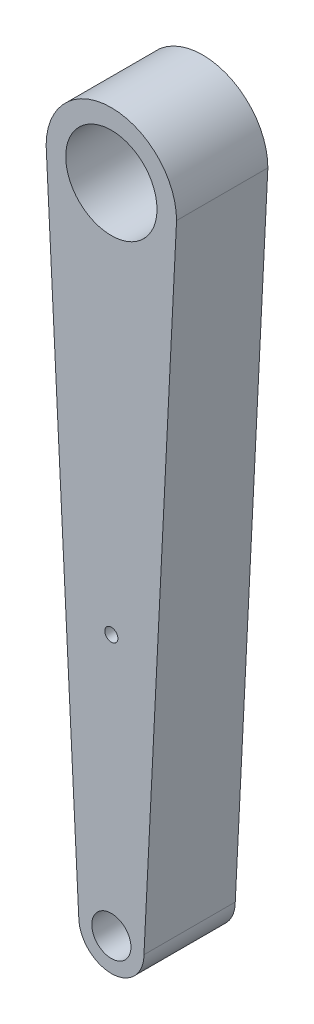
ISO-10303-21;
HEADER;
FILE_DESCRIPTION(('STEP AP214'),'2;1');
FILE_NAME('part.step','',(''),(''),'','','');
FILE_SCHEMA(('AUTOMOTIVE_DESIGN { 1 0 10303 214 1 1 1 1 }'));
ENDSEC;
DATA;
#1=APPLICATION_CONTEXT('core data for automotive mechanical design processes');
#2=APPLICATION_PROTOCOL_DEFINITION('international standard','automotive_design',2000,#1);
#3=PRODUCT_CONTEXT('',#1,'mechanical');
#4=PRODUCT('Part','Part','',(#3));
#5=PRODUCT_RELATED_PRODUCT_CATEGORY('part','',(#4));
#6=PRODUCT_DEFINITION_FORMATION('','',#4);
#7=PRODUCT_DEFINITION_CONTEXT('part definition',#1,'design');
#8=PRODUCT_DEFINITION('design','',#6,#7);
#9=PRODUCT_DEFINITION_SHAPE('','',#8);
#10=(LENGTH_UNIT() NAMED_UNIT(*) SI_UNIT(.MILLI.,.METRE.));
#11=(NAMED_UNIT(*) PLANE_ANGLE_UNIT() SI_UNIT($,.RADIAN.));
#12=(NAMED_UNIT(*) SI_UNIT($,.STERADIAN.) SOLID_ANGLE_UNIT());
#13=UNCERTAINTY_MEASURE_WITH_UNIT(LENGTH_MEASURE(1.E-05),#10,'distance_accuracy_value','');
#14=(GEOMETRIC_REPRESENTATION_CONTEXT(3) GLOBAL_UNCERTAINTY_ASSIGNED_CONTEXT((#13)) GLOBAL_UNIT_ASSIGNED_CONTEXT((#10,
#11,#12)) REPRESENTATION_CONTEXT('',''));
#15=CARTESIAN_POINT('',(0.,0.,0.));
#16=DIRECTION('',(0.,0.,1.));
#17=DIRECTION('',(1.,0.,0.));
#18=AXIS2_PLACEMENT_3D('',#15,#16,#17);
#19=CARTESIAN_POINT('',(-3.49127182044888,-0.174563591022444,7.));
#20=DIRECTION('',(-0.998752338877845,-0.0499376169438922,0.));
#21=DIRECTION('',(0.0499376169438922,-0.998752338877845,0.));
#22=AXIS2_PLACEMENT_3D('',#19,#20,#21);
#23=PLANE('',#22);
#24=DIRECTION('',(-0.0499376169438922,0.998752338877845,0.));
#25=VECTOR('',#24,1.);
#26=CARTESIAN_POINT('',(-3.49127182044888,-0.174563591022444,0.));
#27=LINE('',#26,#25);
#28=CARTESIAN_POINT('',(-2.5,-20.,0.));
#29=VERTEX_POINT('',#28);
#30=CARTESIAN_POINT('',(-5.,30.,0.));
#31=VERTEX_POINT('',#30);
#32=EDGE_CURVE('E110',#29,#31,#27,.T.);
#33=ORIENTED_EDGE('',*,*,#32,.F.);
#34=DIRECTION('',(0.,0.,-1.));
#35=VECTOR('',#34,1.);
#36=CARTESIAN_POINT('',(-2.5,-20.,7.));
#37=LINE('',#36,#35);
#38=CARTESIAN_POINT('',(-2.5,-20.,7.));
#39=VERTEX_POINT('',#38);
#40=EDGE_CURVE('E11',#39,#29,#37,.T.);
#41=ORIENTED_EDGE('',*,*,#40,.F.);
#42=DIRECTION('',(-0.0499376169438922,0.998752338877845,0.));
#43=VECTOR('',#42,1.);
#44=CARTESIAN_POINT('',(-3.49127182044888,-0.174563591022444,7.));
#45=LINE('',#44,#43);
#46=CARTESIAN_POINT('',(-5.,30.,7.));
#47=VERTEX_POINT('',#46);
#48=EDGE_CURVE('E88',#39,#47,#45,.T.);
#49=ORIENTED_EDGE('',*,*,#48,.T.);
#50=DIRECTION('',(0.,0.,-1.));
#51=VECTOR('',#50,1.);
#52=CARTESIAN_POINT('',(-5.,30.,7.));
#53=LINE('',#52,#51);
#54=EDGE_CURVE('E78',#47,#31,#53,.T.);
#55=ORIENTED_EDGE('',*,*,#54,.T.);
#56=EDGE_LOOP('',(#33,#41,#49,#55));
#57=FACE_BOUND('',#56,.T.);
#58=ADVANCED_FACE('F39',(#57),#23,.T.);
#59=CARTESIAN_POINT('',(0.,-20.,7.));
#60=DIRECTION('',(0.,0.,-1.));
#61=DIRECTION('',(-1.,0.,0.));
#62=AXIS2_PLACEMENT_3D('',#59,#60,#61);
#63=CYLINDRICAL_SURFACE('',#62,2.5);
#64=CARTESIAN_POINT('',(0.,-20.,0.));
#65=DIRECTION('',(0.,0.,1.));
#66=DIRECTION('',(1.,0.,0.));
#67=AXIS2_PLACEMENT_3D('',#64,#65,#66);
#68=CIRCLE('',#67,2.5);
#69=CARTESIAN_POINT('',(2.5,-20.,0.));
#70=VERTEX_POINT('',#69);
#71=EDGE_CURVE('E94',#29,#70,#68,.T.);
#72=ORIENTED_EDGE('',*,*,#71,.T.);
#73=DIRECTION('',(0.,0.,-1.));
#74=VECTOR('',#73,1.);
#75=CARTESIAN_POINT('',(2.5,-20.,7.));
#76=LINE('',#75,#74);
#77=CARTESIAN_POINT('',(2.5,-20.,7.));
#78=VERTEX_POINT('',#77);
#79=EDGE_CURVE('E48',#78,#70,#76,.T.);
#80=ORIENTED_EDGE('',*,*,#79,.F.);
#81=CARTESIAN_POINT('',(0.,-20.,7.));
#82=DIRECTION('',(0.,0.,1.));
#83=DIRECTION('',(1.,0.,0.));
#84=AXIS2_PLACEMENT_3D('',#81,#82,#83);
#85=CIRCLE('',#84,2.5);
#86=EDGE_CURVE('E83',#39,#78,#85,.T.);
#87=ORIENTED_EDGE('',*,*,#86,.F.);
#88=ORIENTED_EDGE('',*,*,#40,.T.);
#89=EDGE_LOOP('',(#72,#80,#87,#88));
#90=FACE_BOUND('',#89,.T.);
#91=ADVANCED_FACE('F92',(#90),#63,.T.);
#92=CARTESIAN_POINT('',(3.49127182044888,-0.174563591022444,7.));
#93=DIRECTION('',(0.998752338877845,-0.0499376169438922,0.));
#94=DIRECTION('',(0.0499376169438922,0.998752338877845,0.));
#95=AXIS2_PLACEMENT_3D('',#92,#93,#94);
#96=PLANE('',#95);
#97=DIRECTION('',(-0.0499376169438922,-0.998752338877845,0.));
#98=VECTOR('',#97,1.);
#99=CARTESIAN_POINT('',(3.49127182044888,-0.174563591022444,0.));
#100=LINE('',#99,#98);
#101=CARTESIAN_POINT('',(5.,30.,0.));
#102=VERTEX_POINT('',#101);
#103=EDGE_CURVE('E114',#102,#70,#100,.T.);
#104=ORIENTED_EDGE('',*,*,#103,.F.);
#105=DIRECTION('',(0.,0.,-1.));
#106=VECTOR('',#105,1.);
#107=CARTESIAN_POINT('',(5.,30.,7.));
#108=LINE('',#107,#106);
#109=CARTESIAN_POINT('',(5.,30.,7.));
#110=VERTEX_POINT('',#109);
#111=EDGE_CURVE('E71',#110,#102,#108,.T.);
#112=ORIENTED_EDGE('',*,*,#111,.F.);
#113=DIRECTION('',(-0.0499376169438922,-0.998752338877845,0.));
#114=VECTOR('',#113,1.);
#115=CARTESIAN_POINT('',(3.49127182044888,-0.174563591022444,7.));
#116=LINE('',#115,#114);
#117=EDGE_CURVE('E87',#110,#78,#116,.T.);
#118=ORIENTED_EDGE('',*,*,#117,.T.);
#119=ORIENTED_EDGE('',*,*,#79,.T.);
#120=EDGE_LOOP('',(#104,#112,#118,#119));
#121=FACE_BOUND('',#120,.T.);
#122=ADVANCED_FACE('F98',(#121),#96,.T.);
#123=CARTESIAN_POINT('',(0.,30.,7.));
#124=DIRECTION('',(0.,0.,-1.));
#125=DIRECTION('',(-1.,0.,0.));
#126=AXIS2_PLACEMENT_3D('',#123,#124,#125);
#127=CYLINDRICAL_SURFACE('',#126,3.5);
#128=CARTESIAN_POINT('',(0.,30.,7.));
#129=DIRECTION('',(0.,0.,1.));
#130=DIRECTION('',(1.,0.,0.));
#131=AXIS2_PLACEMENT_3D('',#128,#129,#130);
#132=CIRCLE('',#131,3.5);
#133=CARTESIAN_POINT('',(3.5,30.,7.));
#134=VERTEX_POINT('',#133);
#135=EDGE_CURVE('E126',#134,#134,#132,.T.);
#136=ORIENTED_EDGE('',*,*,#135,.T.);
#137=EDGE_LOOP('',(#136));
#138=FACE_BOUND('',#137,.T.);
#139=CARTESIAN_POINT('',(0.,30.,0.));
#140=DIRECTION('',(0.,0.,1.));
#141=DIRECTION('',(1.,0.,0.));
#142=AXIS2_PLACEMENT_3D('',#139,#140,#141);
#143=CIRCLE('',#142,3.5);
#144=CARTESIAN_POINT('',(3.5,30.,0.));
#145=VERTEX_POINT('',#144);
#146=EDGE_CURVE('E106',#145,#145,#143,.T.);
#147=ORIENTED_EDGE('',*,*,#146,.F.);
#148=EDGE_LOOP('',(#147));
#149=FACE_BOUND('',#148,.T.);
#150=ADVANCED_FACE('F139',(#138,#149),#127,.F.);
#151=CARTESIAN_POINT('',(0.,-20.,7.));
#152=DIRECTION('',(0.,0.,-1.));
#153=DIRECTION('',(-1.,0.,0.));
#154=AXIS2_PLACEMENT_3D('',#151,#152,#153);
#155=CYLINDRICAL_SURFACE('',#154,1.5);
#156=CARTESIAN_POINT('',(0.,-20.,7.));
#157=DIRECTION('',(0.,0.,1.));
#158=DIRECTION('',(1.,0.,0.));
#159=AXIS2_PLACEMENT_3D('',#156,#157,#158);
#160=CIRCLE('',#159,1.5);
#161=CARTESIAN_POINT('',(1.5,-20.,7.));
#162=VERTEX_POINT('',#161);
#163=EDGE_CURVE('E121',#162,#162,#160,.T.);
#164=ORIENTED_EDGE('',*,*,#163,.T.);
#165=EDGE_LOOP('',(#164));
#166=FACE_BOUND('',#165,.T.);
#167=CARTESIAN_POINT('',(0.,-20.,0.));
#168=DIRECTION('',(0.,0.,1.));
#169=DIRECTION('',(1.,0.,0.));
#170=AXIS2_PLACEMENT_3D('',#167,#168,#169);
#171=CIRCLE('',#170,1.5);
#172=CARTESIAN_POINT('',(1.5,-20.,0.));
#173=VERTEX_POINT('',#172);
#174=EDGE_CURVE('E103',#173,#173,#171,.T.);
#175=ORIENTED_EDGE('',*,*,#174,.F.);
#176=EDGE_LOOP('',(#175));
#177=FACE_BOUND('',#176,.T.);
#178=ADVANCED_FACE('F141',(#166,#177),#155,.F.);
#179=CARTESIAN_POINT('',(0.,0.,7.));
#180=DIRECTION('',(0.,0.,-1.));
#181=DIRECTION('',(-1.,0.,0.));
#182=AXIS2_PLACEMENT_3D('',#179,#180,#181);
#183=CYLINDRICAL_SURFACE('',#182,0.5);
#184=CARTESIAN_POINT('',(0.,0.,7.));
#185=DIRECTION('',(0.,0.,1.));
#186=DIRECTION('',(1.,0.,0.));
#187=AXIS2_PLACEMENT_3D('',#184,#185,#186);
#188=CIRCLE('',#187,0.5);
#189=CARTESIAN_POINT('',(0.5,0.,7.));
#190=VERTEX_POINT('',#189);
#191=EDGE_CURVE('E118',#190,#190,#188,.T.);
#192=ORIENTED_EDGE('',*,*,#191,.T.);
#193=EDGE_LOOP('',(#192));
#194=FACE_BOUND('',#193,.T.);
#195=CARTESIAN_POINT('',(0.,0.,0.));
#196=DIRECTION('',(0.,0.,1.));
#197=DIRECTION('',(1.,0.,0.));
#198=AXIS2_PLACEMENT_3D('',#195,#196,#197);
#199=CIRCLE('',#198,0.5);
#200=CARTESIAN_POINT('',(0.5,0.,0.));
#201=VERTEX_POINT('',#200);
#202=EDGE_CURVE('E107',#201,#201,#199,.T.);
#203=ORIENTED_EDGE('',*,*,#202,.F.);
#204=EDGE_LOOP('',(#203));
#205=FACE_BOUND('',#204,.T.);
#206=ADVANCED_FACE('F41',(#194,#205),#183,.F.);
#207=CARTESIAN_POINT('',(0.,30.,7.));
#208=DIRECTION('',(0.,0.,-1.));
#209=DIRECTION('',(-1.,0.,0.));
#210=AXIS2_PLACEMENT_3D('',#207,#208,#209);
#211=CYLINDRICAL_SURFACE('',#210,5.);
#212=CARTESIAN_POINT('',(0.,30.,0.));
#213=DIRECTION('',(0.,0.,1.));
#214=DIRECTION('',(1.,0.,0.));
#215=AXIS2_PLACEMENT_3D('',#212,#213,#214);
#216=CIRCLE('',#215,5.);
#217=EDGE_CURVE('E116',#102,#31,#216,.T.);
#218=ORIENTED_EDGE('',*,*,#217,.T.);
#219=ORIENTED_EDGE('',*,*,#54,.F.);
#220=CARTESIAN_POINT('',(0.,30.,7.));
#221=DIRECTION('',(0.,0.,1.));
#222=DIRECTION('',(1.,0.,0.));
#223=AXIS2_PLACEMENT_3D('',#220,#221,#222);
#224=CIRCLE('',#223,5.);
#225=EDGE_CURVE('E56',#110,#47,#224,.T.);
#226=ORIENTED_EDGE('',*,*,#225,.F.);
#227=ORIENTED_EDGE('',*,*,#111,.T.);
#228=EDGE_LOOP('',(#218,#219,#226,#227));
#229=FACE_BOUND('',#228,.T.);
#230=ADVANCED_FACE('F148',(#229),#211,.T.);
#231=CARTESIAN_POINT('',(0.,0.,7.));
#232=DIRECTION('',(0.,0.,1.));
#233=DIRECTION('',(1.,0.,0.));
#234=AXIS2_PLACEMENT_3D('',#231,#232,#233);
#235=PLANE('',#234);
#236=ORIENTED_EDGE('',*,*,#191,.F.);
#237=EDGE_LOOP('',(#236));
#238=FACE_BOUND('',#237,.T.);
#239=ORIENTED_EDGE('',*,*,#163,.F.);
#240=EDGE_LOOP('',(#239));
#241=FACE_BOUND('',#240,.T.);
#242=ORIENTED_EDGE('',*,*,#135,.F.);
#243=EDGE_LOOP('',(#242));
#244=FACE_BOUND('',#243,.T.);
#245=ORIENTED_EDGE('',*,*,#48,.F.);
#246=ORIENTED_EDGE('',*,*,#86,.T.);
#247=ORIENTED_EDGE('',*,*,#117,.F.);
#248=ORIENTED_EDGE('',*,*,#225,.T.);
#249=EDGE_LOOP('',(#245,#246,#247,#248));
#250=FACE_BOUND('',#249,.T.);
#251=ADVANCED_FACE('F85',(#238,#241,#244,#250),#235,.T.);
#252=CARTESIAN_POINT('',(0.,0.,0.));
#253=DIRECTION('',(0.,0.,1.));
#254=DIRECTION('',(1.,0.,0.));
#255=AXIS2_PLACEMENT_3D('',#252,#253,#254);
#256=PLANE('',#255);
#257=ORIENTED_EDGE('',*,*,#202,.T.);
#258=EDGE_LOOP('',(#257));
#259=FACE_BOUND('',#258,.T.);
#260=ORIENTED_EDGE('',*,*,#174,.T.);
#261=EDGE_LOOP('',(#260));
#262=FACE_BOUND('',#261,.T.);
#263=ORIENTED_EDGE('',*,*,#146,.T.);
#264=EDGE_LOOP('',(#263));
#265=FACE_BOUND('',#264,.T.);
#266=ORIENTED_EDGE('',*,*,#32,.T.);
#267=ORIENTED_EDGE('',*,*,#217,.F.);
#268=ORIENTED_EDGE('',*,*,#103,.T.);
#269=ORIENTED_EDGE('',*,*,#71,.F.);
#270=EDGE_LOOP('',(#266,#267,#268,#269));
#271=FACE_BOUND('',#270,.T.);
#272=ADVANCED_FACE('F153',(#259,#262,#265,#271),#256,.F.);
#273=CLOSED_SHELL('',(#58,#91,#122,#150,#178,#206,#230,#251,#272));
#274=MANIFOLD_SOLID_BREP('B2',#273);
#275=ADVANCED_BREP_SHAPE_REPRESENTATION('',(#18,#274),#14);
#276=SHAPE_DEFINITION_REPRESENTATION(#9,#275);
ENDSEC;
END-ISO-10303-21;
